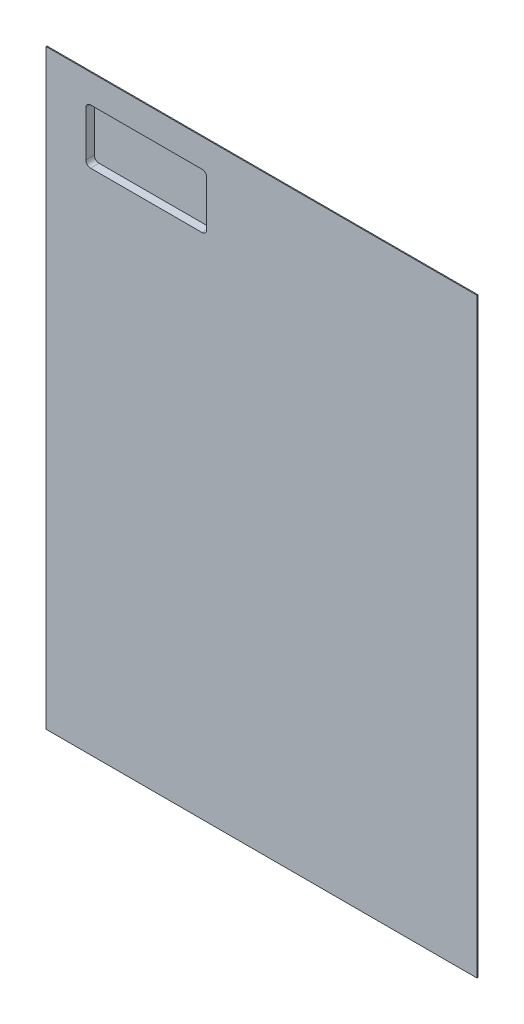
ISO-10303-21;
HEADER;
FILE_DESCRIPTION(('STEP AP214'),'2;1');
FILE_NAME('part.step','',(''),(''),'','','');
FILE_SCHEMA(('AUTOMOTIVE_DESIGN { 1 0 10303 214 1 1 1 1 }'));
ENDSEC;
DATA;
#1=APPLICATION_CONTEXT('core data for automotive mechanical design processes');
#2=APPLICATION_PROTOCOL_DEFINITION('international standard','automotive_design',2000,#1);
#3=PRODUCT_CONTEXT('',#1,'mechanical');
#4=PRODUCT('Part','Part','',(#3));
#5=PRODUCT_RELATED_PRODUCT_CATEGORY('part','',(#4));
#6=PRODUCT_DEFINITION_FORMATION('','',#4);
#7=PRODUCT_DEFINITION_CONTEXT('part definition',#1,'design');
#8=PRODUCT_DEFINITION('design','',#6,#7);
#9=PRODUCT_DEFINITION_SHAPE('','',#8);
#10=(LENGTH_UNIT() NAMED_UNIT(*) SI_UNIT(.MILLI.,.METRE.));
#11=(NAMED_UNIT(*) PLANE_ANGLE_UNIT() SI_UNIT($,.RADIAN.));
#12=(NAMED_UNIT(*) SI_UNIT($,.STERADIAN.) SOLID_ANGLE_UNIT());
#13=UNCERTAINTY_MEASURE_WITH_UNIT(LENGTH_MEASURE(1.E-05),#10,'distance_accuracy_value','');
#14=(GEOMETRIC_REPRESENTATION_CONTEXT(3) GLOBAL_UNCERTAINTY_ASSIGNED_CONTEXT((#13)) GLOBAL_UNIT_ASSIGNED_CONTEXT((#10,
#11,#12)) REPRESENTATION_CONTEXT('',''));
#15=CARTESIAN_POINT('',(0.,0.,0.));
#16=DIRECTION('',(0.,0.,1.));
#17=DIRECTION('',(1.,0.,0.));
#18=AXIS2_PLACEMENT_3D('',#15,#16,#17);
#19=CARTESIAN_POINT('',(228.,313.,-1.));
#20=DIRECTION('',(1.,0.,0.));
#21=DIRECTION('',(0.,1.,0.));
#22=AXIS2_PLACEMENT_3D('',#19,#20,#21);
#23=PLANE('',#22);
#24=DIRECTION('',(0.,1.,0.));
#25=VECTOR('',#24,1.);
#26=CARTESIAN_POINT('',(228.,313.,0.));
#27=LINE('',#26,#25);
#28=CARTESIAN_POINT('',(228.,-313.,0.));
#29=VERTEX_POINT('',#28);
#30=CARTESIAN_POINT('',(228.,313.,0.));
#31=VERTEX_POINT('',#30);
#32=EDGE_CURVE('E207',#29,#31,#27,.T.);
#33=ORIENTED_EDGE('',*,*,#32,.F.);
#34=DIRECTION('',(0.,0.,1.));
#35=VECTOR('',#34,1.);
#36=CARTESIAN_POINT('',(228.,-313.,-1.));
#37=LINE('',#36,#35);
#38=CARTESIAN_POINT('',(228.,-313.,-1.));
#39=VERTEX_POINT('',#38);
#40=EDGE_CURVE('E195',#39,#29,#37,.T.);
#41=ORIENTED_EDGE('',*,*,#40,.F.);
#42=DIRECTION('',(0.,1.,0.));
#43=VECTOR('',#42,1.);
#44=CARTESIAN_POINT('',(228.,313.,-1.));
#45=LINE('',#44,#43);
#46=CARTESIAN_POINT('',(228.,313.,-1.));
#47=VERTEX_POINT('',#46);
#48=EDGE_CURVE('E190',#39,#47,#45,.T.);
#49=ORIENTED_EDGE('',*,*,#48,.T.);
#50=DIRECTION('',(0.,0.,1.));
#51=VECTOR('',#50,1.);
#52=CARTESIAN_POINT('',(228.,313.,-1.));
#53=LINE('',#52,#51);
#54=EDGE_CURVE('E172',#47,#31,#53,.T.);
#55=ORIENTED_EDGE('',*,*,#54,.T.);
#56=EDGE_LOOP('',(#33,#41,#49,#55));
#57=FACE_BOUND('',#56,.T.);
#58=ADVANCED_FACE('F36',(#57),#23,.T.);
#59=CARTESIAN_POINT('',(-228.,-313.,-1.));
#60=DIRECTION('',(0.,-1.,0.));
#61=DIRECTION('',(0.,0.,-1.));
#62=AXIS2_PLACEMENT_3D('',#59,#60,#61);
#63=PLANE('',#62);
#64=DIRECTION('',(1.,0.,0.));
#65=VECTOR('',#64,1.);
#66=CARTESIAN_POINT('',(-228.,-313.,0.));
#67=LINE('',#66,#65);
#68=CARTESIAN_POINT('',(-228.,-313.,0.));
#69=VERTEX_POINT('',#68);
#70=EDGE_CURVE('E196',#69,#29,#67,.T.);
#71=ORIENTED_EDGE('',*,*,#70,.F.);
#72=DIRECTION('',(0.,0.,1.));
#73=VECTOR('',#72,1.);
#74=CARTESIAN_POINT('',(-228.,-313.,-1.));
#75=LINE('',#74,#73);
#76=CARTESIAN_POINT('',(-228.,-313.,-1.));
#77=VERTEX_POINT('',#76);
#78=EDGE_CURVE('E214',#77,#69,#75,.T.);
#79=ORIENTED_EDGE('',*,*,#78,.F.);
#80=DIRECTION('',(1.,0.,0.));
#81=VECTOR('',#80,1.);
#82=CARTESIAN_POINT('',(-228.,-313.,-1.));
#83=LINE('',#82,#81);
#84=EDGE_CURVE('E183',#77,#39,#83,.T.);
#85=ORIENTED_EDGE('',*,*,#84,.T.);
#86=ORIENTED_EDGE('',*,*,#40,.T.);
#87=EDGE_LOOP('',(#71,#79,#85,#86));
#88=FACE_BOUND('',#87,.T.);
#89=ADVANCED_FACE('F391',(#88),#63,.T.);
#90=CARTESIAN_POINT('',(-228.,313.,-1.));
#91=DIRECTION('',(-1.,0.,0.));
#92=DIRECTION('',(0.,-1.,0.));
#93=AXIS2_PLACEMENT_3D('',#90,#91,#92);
#94=PLANE('',#93);
#95=DIRECTION('',(0.,-1.,0.));
#96=VECTOR('',#95,1.);
#97=CARTESIAN_POINT('',(-228.,313.,0.));
#98=LINE('',#97,#96);
#99=CARTESIAN_POINT('',(-228.,313.,0.));
#100=VERTEX_POINT('',#99);
#101=EDGE_CURVE('E199',#100,#69,#98,.T.);
#102=ORIENTED_EDGE('',*,*,#101,.F.);
#103=DIRECTION('',(0.,0.,1.));
#104=VECTOR('',#103,1.);
#105=CARTESIAN_POINT('',(-228.,313.,-1.));
#106=LINE('',#105,#104);
#107=CARTESIAN_POINT('',(-228.,313.,-1.));
#108=VERTEX_POINT('',#107);
#109=EDGE_CURVE('E182',#108,#100,#106,.T.);
#110=ORIENTED_EDGE('',*,*,#109,.F.);
#111=DIRECTION('',(0.,-1.,0.));
#112=VECTOR('',#111,1.);
#113=CARTESIAN_POINT('',(-228.,313.,-1.));
#114=LINE('',#113,#112);
#115=EDGE_CURVE('E193',#108,#77,#114,.T.);
#116=ORIENTED_EDGE('',*,*,#115,.T.);
#117=ORIENTED_EDGE('',*,*,#78,.T.);
#118=EDGE_LOOP('',(#102,#110,#116,#117));
#119=FACE_BOUND('',#118,.T.);
#120=ADVANCED_FACE('F395',(#119),#94,.T.);
#121=CARTESIAN_POINT('',(-228.,313.,-1.));
#122=DIRECTION('',(0.,1.,0.));
#123=DIRECTION('',(0.,0.,1.));
#124=AXIS2_PLACEMENT_3D('',#121,#122,#123);
#125=PLANE('',#124);
#126=DIRECTION('',(-1.,0.,0.));
#127=VECTOR('',#126,1.);
#128=CARTESIAN_POINT('',(-228.,313.,0.));
#129=LINE('',#128,#127);
#130=EDGE_CURVE('E177',#31,#100,#129,.T.);
#131=ORIENTED_EDGE('',*,*,#130,.F.);
#132=ORIENTED_EDGE('',*,*,#54,.F.);
#133=DIRECTION('',(-1.,0.,0.));
#134=VECTOR('',#133,1.);
#135=CARTESIAN_POINT('',(-228.,313.,-1.));
#136=LINE('',#135,#134);
#137=EDGE_CURVE('E175',#47,#108,#136,.T.);
#138=ORIENTED_EDGE('',*,*,#137,.T.);
#139=ORIENTED_EDGE('',*,*,#109,.T.);
#140=EDGE_LOOP('',(#131,#132,#138,#139));
#141=FACE_BOUND('',#140,.T.);
#142=ADVANCED_FACE('F174',(#141),#125,.T.);
#143=CARTESIAN_POINT('',(0.,0.,-1.));
#144=DIRECTION('',(0.,0.,1.));
#145=DIRECTION('',(1.,0.,0.));
#146=AXIS2_PLACEMENT_3D('',#143,#144,#145);
#147=PLANE('',#146);
#148=DIRECTION('',(0.,-1.,0.));
#149=VECTOR('',#148,1.);
#150=CARTESIAN_POINT('',(-187.,0.,-1.));
#151=LINE('',#150,#149);
#152=CARTESIAN_POINT('',(-187.,279.,-1.));
#153=VERTEX_POINT('',#152);
#154=CARTESIAN_POINT('',(-187.,229.,-1.));
#155=VERTEX_POINT('',#154);
#156=EDGE_CURVE('E336',#153,#155,#151,.T.);
#157=ORIENTED_EDGE('',*,*,#156,.T.);
#158=CARTESIAN_POINT('',(-182.,229.,-0.999999999999999));
#159=DIRECTION('',(0.,0.,1.));
#160=DIRECTION('',(1.,0.,0.));
#161=AXIS2_PLACEMENT_3D('',#158,#159,#160);
#162=CIRCLE('',#161,5.);
#163=CARTESIAN_POINT('',(-182.,224.,-1.));
#164=VERTEX_POINT('',#163);
#165=EDGE_CURVE('E275',#155,#164,#162,.T.);
#166=ORIENTED_EDGE('',*,*,#165,.T.);
#167=DIRECTION('',(1.,0.,0.));
#168=VECTOR('',#167,1.);
#169=CARTESIAN_POINT('',(0.,224.,-1.));
#170=LINE('',#169,#168);
#171=CARTESIAN_POINT('',(-62.0000000000001,224.,-1.));
#172=VERTEX_POINT('',#171);
#173=EDGE_CURVE('E338',#164,#172,#170,.T.);
#174=ORIENTED_EDGE('',*,*,#173,.T.);
#175=CARTESIAN_POINT('',(-62.0000000000001,229.,-0.999999999999999));
#176=DIRECTION('',(0.,0.,1.));
#177=DIRECTION('',(1.,0.,0.));
#178=AXIS2_PLACEMENT_3D('',#175,#176,#177);
#179=CIRCLE('',#178,5.);
#180=CARTESIAN_POINT('',(-57.0000000000001,229.,-1.));
#181=VERTEX_POINT('',#180);
#182=EDGE_CURVE('E273',#172,#181,#179,.T.);
#183=ORIENTED_EDGE('',*,*,#182,.T.);
#184=DIRECTION('',(0.,1.,0.));
#185=VECTOR('',#184,1.);
#186=CARTESIAN_POINT('',(-57.0000000000001,0.,-1.));
#187=LINE('',#186,#185);
#188=CARTESIAN_POINT('',(-57.0000000000001,279.,-1.));
#189=VERTEX_POINT('',#188);
#190=EDGE_CURVE('E202',#181,#189,#187,.T.);
#191=ORIENTED_EDGE('',*,*,#190,.T.);
#192=CARTESIAN_POINT('',(-62.0000000000001,279.,-0.999999999999999));
#193=DIRECTION('',(0.,0.,1.));
#194=DIRECTION('',(1.,0.,0.));
#195=AXIS2_PLACEMENT_3D('',#192,#193,#194);
#196=CIRCLE('',#195,5.);
#197=CARTESIAN_POINT('',(-62.0000000000001,284.,-1.));
#198=VERTEX_POINT('',#197);
#199=EDGE_CURVE('E271',#189,#198,#196,.T.);
#200=ORIENTED_EDGE('',*,*,#199,.T.);
#201=DIRECTION('',(-1.,0.,0.));
#202=VECTOR('',#201,1.);
#203=CARTESIAN_POINT('',(0.,284.,-1.));
#204=LINE('',#203,#202);
#205=CARTESIAN_POINT('',(-182.,284.,-1.));
#206=VERTEX_POINT('',#205);
#207=EDGE_CURVE('E333',#198,#206,#204,.T.);
#208=ORIENTED_EDGE('',*,*,#207,.T.);
#209=CARTESIAN_POINT('',(-182.,279.,-0.999999999999999));
#210=DIRECTION('',(0.,0.,1.));
#211=DIRECTION('',(1.,0.,0.));
#212=AXIS2_PLACEMENT_3D('',#209,#210,#211);
#213=CIRCLE('',#212,5.);
#214=EDGE_CURVE('E277',#206,#153,#213,.T.);
#215=ORIENTED_EDGE('',*,*,#214,.T.);
#216=EDGE_LOOP('',(#157,#166,#174,#183,#191,#200,#208,#215));
#217=FACE_BOUND('',#216,.T.);
#218=ORIENTED_EDGE('',*,*,#48,.F.);
#219=ORIENTED_EDGE('',*,*,#84,.F.);
#220=ORIENTED_EDGE('',*,*,#115,.F.);
#221=ORIENTED_EDGE('',*,*,#137,.F.);
#222=EDGE_LOOP('',(#218,#219,#220,#221));
#223=FACE_BOUND('',#222,.T.);
#224=ADVANCED_FACE('F188',(#217,#223),#147,.F.);
#225=CARTESIAN_POINT('',(0.,0.,0.));
#226=DIRECTION('',(0.,0.,1.));
#227=DIRECTION('',(1.,0.,0.));
#228=AXIS2_PLACEMENT_3D('',#225,#226,#227);
#229=PLANE('',#228);
#230=DIRECTION('',(0.,-1.,0.));
#231=VECTOR('',#230,1.);
#232=CARTESIAN_POINT('',(-186.,283.,0.));
#233=LINE('',#232,#231);
#234=CARTESIAN_POINT('',(-186.,278.,0.));
#235=VERTEX_POINT('',#234);
#236=CARTESIAN_POINT('',(-186.,230.,0.));
#237=VERTEX_POINT('',#236);
#238=EDGE_CURVE('E315',#235,#237,#233,.T.);
#239=ORIENTED_EDGE('',*,*,#238,.F.);
#240=CARTESIAN_POINT('',(-181.,278.,0.));
#241=DIRECTION('',(0.,0.,1.));
#242=DIRECTION('',(1.,0.,0.));
#243=AXIS2_PLACEMENT_3D('',#240,#241,#242);
#244=CIRCLE('',#243,5.);
#245=CARTESIAN_POINT('',(-181.,283.,0.));
#246=VERTEX_POINT('',#245);
#247=EDGE_CURVE('E11',#235,#246,#244,.F.);
#248=ORIENTED_EDGE('',*,*,#247,.T.);
#249=DIRECTION('',(-1.,0.,0.));
#250=VECTOR('',#249,1.);
#251=CARTESIAN_POINT('',(-186.,283.,0.));
#252=LINE('',#251,#250);
#253=CARTESIAN_POINT('',(-63.0000000000001,283.,0.));
#254=VERTEX_POINT('',#253);
#255=EDGE_CURVE('E286',#254,#246,#252,.T.);
#256=ORIENTED_EDGE('',*,*,#255,.F.);
#257=CARTESIAN_POINT('',(-63.0000000000001,278.,0.));
#258=DIRECTION('',(0.,0.,1.));
#259=DIRECTION('',(1.,0.,0.));
#260=AXIS2_PLACEMENT_3D('',#257,#258,#259);
#261=CIRCLE('',#260,5.);
#262=CARTESIAN_POINT('',(-58.0000000000001,278.,0.));
#263=VERTEX_POINT('',#262);
#264=EDGE_CURVE('E44',#254,#263,#261,.F.);
#265=ORIENTED_EDGE('',*,*,#264,.T.);
#266=DIRECTION('',(0.,1.,0.));
#267=VECTOR('',#266,1.);
#268=CARTESIAN_POINT('',(-58.0000000000001,283.,0.));
#269=LINE('',#268,#267);
#270=CARTESIAN_POINT('',(-58.0000000000001,230.,0.));
#271=VERTEX_POINT('',#270);
#272=EDGE_CURVE('E285',#271,#263,#269,.T.);
#273=ORIENTED_EDGE('',*,*,#272,.F.);
#274=CARTESIAN_POINT('',(-63.0000000000001,230.,0.));
#275=DIRECTION('',(0.,0.,1.));
#276=DIRECTION('',(1.,0.,0.));
#277=AXIS2_PLACEMENT_3D('',#274,#275,#276);
#278=CIRCLE('',#277,5.);
#279=CARTESIAN_POINT('',(-63.0000000000001,225.,0.));
#280=VERTEX_POINT('',#279);
#281=EDGE_CURVE('E279',#271,#280,#278,.F.);
#282=ORIENTED_EDGE('',*,*,#281,.T.);
#283=DIRECTION('',(1.,0.,0.));
#284=VECTOR('',#283,1.);
#285=CARTESIAN_POINT('',(-186.,225.,0.));
#286=LINE('',#285,#284);
#287=CARTESIAN_POINT('',(-181.,225.,0.));
#288=VERTEX_POINT('',#287);
#289=EDGE_CURVE('E292',#288,#280,#286,.T.);
#290=ORIENTED_EDGE('',*,*,#289,.F.);
#291=CARTESIAN_POINT('',(-181.,230.,0.));
#292=DIRECTION('',(0.,0.,1.));
#293=DIRECTION('',(1.,0.,0.));
#294=AXIS2_PLACEMENT_3D('',#291,#292,#293);
#295=CIRCLE('',#294,5.);
#296=EDGE_CURVE('E281',#288,#237,#295,.F.);
#297=ORIENTED_EDGE('',*,*,#296,.T.);
#298=EDGE_LOOP('',(#239,#248,#256,#265,#273,#282,#290,#297));
#299=FACE_BOUND('',#298,.T.);
#300=ORIENTED_EDGE('',*,*,#32,.T.);
#301=ORIENTED_EDGE('',*,*,#130,.T.);
#302=ORIENTED_EDGE('',*,*,#101,.T.);
#303=ORIENTED_EDGE('',*,*,#70,.T.);
#304=EDGE_LOOP('',(#300,#301,#302,#303));
#305=FACE_BOUND('',#304,.T.);
#306=ADVANCED_FACE('F38',(#299,#305),#229,.T.);
#307=CARTESIAN_POINT('',(-57.0000000000001,284.,-10.));
#308=DIRECTION('',(1.,0.,0.));
#309=DIRECTION('',(0.,0.,-1.));
#310=AXIS2_PLACEMENT_3D('',#307,#308,#309);
#311=PLANE('',#310);
#312=DIRECTION('',(0.,1.,0.));
#313=VECTOR('',#312,1.);
#314=CARTESIAN_POINT('',(-57.0000000000001,284.,-10.));
#315=LINE('',#314,#313);
#316=CARTESIAN_POINT('',(-57.0000000000001,229.,-10.));
#317=VERTEX_POINT('',#316);
#318=CARTESIAN_POINT('',(-57.0000000000001,279.,-10.));
#319=VERTEX_POINT('',#318);
#320=EDGE_CURVE('E321',#317,#319,#315,.T.);
#321=ORIENTED_EDGE('',*,*,#320,.T.);
#322=DIRECTION('',(0.,0.,1.));
#323=VECTOR('',#322,1.);
#324=CARTESIAN_POINT('',(-57.0000000000001,279.,-10.));
#325=LINE('',#324,#323);
#326=EDGE_CURVE('E218',#319,#189,#325,.T.);
#327=ORIENTED_EDGE('',*,*,#326,.T.);
#328=ORIENTED_EDGE('',*,*,#190,.F.);
#329=DIRECTION('',(0.,0.,1.));
#330=VECTOR('',#329,1.);
#331=CARTESIAN_POINT('',(-57.0000000000001,229.,-10.));
#332=LINE('',#331,#330);
#333=EDGE_CURVE('E213',#181,#317,#332,.F.);
#334=ORIENTED_EDGE('',*,*,#333,.T.);
#335=EDGE_LOOP('',(#321,#327,#328,#334));
#336=FACE_BOUND('',#335,.T.);
#337=ADVANCED_FACE('F347',(#336),#311,.T.);
#338=CARTESIAN_POINT('',(-187.,224.,-10.));
#339=DIRECTION('',(0.,-1.,0.));
#340=DIRECTION('',(0.,0.,-1.));
#341=AXIS2_PLACEMENT_3D('',#338,#339,#340);
#342=PLANE('',#341);
#343=DIRECTION('',(1.,0.,0.));
#344=VECTOR('',#343,1.);
#345=CARTESIAN_POINT('',(-187.,224.,-10.));
#346=LINE('',#345,#344);
#347=CARTESIAN_POINT('',(-182.,224.,-10.));
#348=VERTEX_POINT('',#347);
#349=CARTESIAN_POINT('',(-62.0000000000001,224.,-10.));
#350=VERTEX_POINT('',#349);
#351=EDGE_CURVE('E330',#348,#350,#346,.T.);
#352=ORIENTED_EDGE('',*,*,#351,.T.);
#353=DIRECTION('',(0.,0.,1.));
#354=VECTOR('',#353,1.);
#355=CARTESIAN_POINT('',(-62.0000000000001,224.,-10.));
#356=LINE('',#355,#354);
#357=EDGE_CURVE('E236',#350,#172,#356,.T.);
#358=ORIENTED_EDGE('',*,*,#357,.T.);
#359=ORIENTED_EDGE('',*,*,#173,.F.);
#360=DIRECTION('',(0.,0.,1.));
#361=VECTOR('',#360,1.);
#362=CARTESIAN_POINT('',(-182.,224.,-10.));
#363=LINE('',#362,#361);
#364=EDGE_CURVE('E234',#164,#348,#363,.F.);
#365=ORIENTED_EDGE('',*,*,#364,.T.);
#366=EDGE_LOOP('',(#352,#358,#359,#365));
#367=FACE_BOUND('',#366,.T.);
#368=ADVANCED_FACE('F360',(#367),#342,.T.);
#369=CARTESIAN_POINT('',(-187.,284.,-10.));
#370=DIRECTION('',(-1.,0.,0.));
#371=DIRECTION('',(0.,-1.,0.));
#372=AXIS2_PLACEMENT_3D('',#369,#370,#371);
#373=PLANE('',#372);
#374=DIRECTION('',(0.,-1.,0.));
#375=VECTOR('',#374,1.);
#376=CARTESIAN_POINT('',(-187.,284.,-10.));
#377=LINE('',#376,#375);
#378=CARTESIAN_POINT('',(-187.,279.,-10.));
#379=VERTEX_POINT('',#378);
#380=CARTESIAN_POINT('',(-187.,229.,-10.));
#381=VERTEX_POINT('',#380);
#382=EDGE_CURVE('E327',#379,#381,#377,.T.);
#383=ORIENTED_EDGE('',*,*,#382,.T.);
#384=DIRECTION('',(0.,0.,1.));
#385=VECTOR('',#384,1.);
#386=CARTESIAN_POINT('',(-187.,229.,-10.));
#387=LINE('',#386,#385);
#388=EDGE_CURVE('E241',#381,#155,#387,.T.);
#389=ORIENTED_EDGE('',*,*,#388,.T.);
#390=ORIENTED_EDGE('',*,*,#156,.F.);
#391=DIRECTION('',(0.,0.,1.));
#392=VECTOR('',#391,1.);
#393=CARTESIAN_POINT('',(-187.,279.,-10.));
#394=LINE('',#393,#392);
#395=EDGE_CURVE('E239',#153,#379,#394,.F.);
#396=ORIENTED_EDGE('',*,*,#395,.T.);
#397=EDGE_LOOP('',(#383,#389,#390,#396));
#398=FACE_BOUND('',#397,.T.);
#399=ADVANCED_FACE('F368',(#398),#373,.T.);
#400=CARTESIAN_POINT('',(-187.,284.,-10.));
#401=DIRECTION('',(0.,1.,0.));
#402=DIRECTION('',(0.,0.,1.));
#403=AXIS2_PLACEMENT_3D('',#400,#401,#402);
#404=PLANE('',#403);
#405=ORIENTED_EDGE('',*,*,#207,.F.);
#406=DIRECTION('',(0.,0.,1.));
#407=VECTOR('',#406,1.);
#408=CARTESIAN_POINT('',(-62.0000000000001,284.,-10.));
#409=LINE('',#408,#407);
#410=CARTESIAN_POINT('',(-62.0000000000001,284.,-10.));
#411=VERTEX_POINT('',#410);
#412=EDGE_CURVE('E224',#198,#411,#409,.F.);
#413=ORIENTED_EDGE('',*,*,#412,.T.);
#414=DIRECTION('',(-1.,0.,0.));
#415=VECTOR('',#414,1.);
#416=CARTESIAN_POINT('',(-187.,284.,-10.));
#417=LINE('',#416,#415);
#418=CARTESIAN_POINT('',(-182.,284.,-10.));
#419=VERTEX_POINT('',#418);
#420=EDGE_CURVE('E324',#411,#419,#417,.T.);
#421=ORIENTED_EDGE('',*,*,#420,.T.);
#422=DIRECTION('',(0.,0.,1.));
#423=VECTOR('',#422,1.);
#424=CARTESIAN_POINT('',(-182.,284.,-10.));
#425=LINE('',#424,#423);
#426=EDGE_CURVE('E221',#419,#206,#425,.T.);
#427=ORIENTED_EDGE('',*,*,#426,.T.);
#428=EDGE_LOOP('',(#405,#413,#421,#427));
#429=FACE_BOUND('',#428,.T.);
#430=ADVANCED_FACE('F376',(#429),#404,.T.);
#431=CARTESIAN_POINT('',(0.,0.,-10.));
#432=DIRECTION('',(0.,0.,1.));
#433=DIRECTION('',(1.,0.,0.));
#434=AXIS2_PLACEMENT_3D('',#431,#432,#433);
#435=PLANE('',#434);
#436=ORIENTED_EDGE('',*,*,#420,.F.);
#437=CARTESIAN_POINT('',(-62.0000000000001,279.,-10.));
#438=DIRECTION('',(0.,0.,1.));
#439=DIRECTION('',(1.,0.,0.));
#440=AXIS2_PLACEMENT_3D('',#437,#438,#439);
#441=CIRCLE('',#440,5.);
#442=EDGE_CURVE('E232',#411,#319,#441,.F.);
#443=ORIENTED_EDGE('',*,*,#442,.T.);
#444=ORIENTED_EDGE('',*,*,#320,.F.);
#445=CARTESIAN_POINT('',(-62.0000000000001,229.,-10.));
#446=DIRECTION('',(0.,0.,1.));
#447=DIRECTION('',(1.,0.,0.));
#448=AXIS2_PLACEMENT_3D('',#445,#446,#447);
#449=CIRCLE('',#448,5.);
#450=EDGE_CURVE('E230',#317,#350,#449,.F.);
#451=ORIENTED_EDGE('',*,*,#450,.T.);
#452=ORIENTED_EDGE('',*,*,#351,.F.);
#453=CARTESIAN_POINT('',(-182.,229.,-10.));
#454=DIRECTION('',(0.,0.,1.));
#455=DIRECTION('',(1.,0.,0.));
#456=AXIS2_PLACEMENT_3D('',#453,#454,#455);
#457=CIRCLE('',#456,5.);
#458=EDGE_CURVE('E228',#348,#381,#457,.F.);
#459=ORIENTED_EDGE('',*,*,#458,.T.);
#460=ORIENTED_EDGE('',*,*,#382,.F.);
#461=CARTESIAN_POINT('',(-182.,279.,-10.));
#462=DIRECTION('',(0.,0.,1.));
#463=DIRECTION('',(1.,0.,0.));
#464=AXIS2_PLACEMENT_3D('',#461,#462,#463);
#465=CIRCLE('',#464,5.);
#466=EDGE_CURVE('E226',#379,#419,#465,.F.);
#467=ORIENTED_EDGE('',*,*,#466,.T.);
#468=EDGE_LOOP('',(#436,#443,#444,#451,#452,#459,#460,#467));
#469=FACE_BOUND('',#468,.T.);
#470=ADVANCED_FACE('F357',(#469),#435,.F.);
#471=CARTESIAN_POINT('',(-186.,283.,-1.));
#472=DIRECTION('',(-1.,0.,0.));
#473=DIRECTION('',(0.,0.,1.));
#474=AXIS2_PLACEMENT_3D('',#471,#472,#473);
#475=PLANE('',#474);
#476=ORIENTED_EDGE('',*,*,#238,.T.);
#477=DIRECTION('',(0.,0.,1.));
#478=VECTOR('',#477,1.);
#479=CARTESIAN_POINT('',(-186.,230.,-9.));
#480=LINE('',#479,#478);
#481=CARTESIAN_POINT('',(-186.,230.,-9.));
#482=VERTEX_POINT('',#481);
#483=EDGE_CURVE('E265',#237,#482,#480,.F.);
#484=ORIENTED_EDGE('',*,*,#483,.T.);
#485=DIRECTION('',(0.,-1.,0.));
#486=VECTOR('',#485,1.);
#487=CARTESIAN_POINT('',(-186.,0.,-9.));
#488=LINE('',#487,#486);
#489=CARTESIAN_POINT('',(-186.,278.,-9.));
#490=VERTEX_POINT('',#489);
#491=EDGE_CURVE('E307',#490,#482,#488,.T.);
#492=ORIENTED_EDGE('',*,*,#491,.F.);
#493=DIRECTION('',(0.,0.,1.));
#494=VECTOR('',#493,1.);
#495=CARTESIAN_POINT('',(-186.,278.,0.));
#496=LINE('',#495,#494);
#497=EDGE_CURVE('E262',#490,#235,#496,.T.);
#498=ORIENTED_EDGE('',*,*,#497,.T.);
#499=EDGE_LOOP('',(#476,#484,#492,#498));
#500=FACE_BOUND('',#499,.T.);
#501=ADVANCED_FACE('F416',(#500),#475,.F.);
#502=CARTESIAN_POINT('',(-186.,283.,-1.));
#503=DIRECTION('',(0.,1.,0.));
#504=DIRECTION('',(0.,0.,1.));
#505=AXIS2_PLACEMENT_3D('',#502,#503,#504);
#506=PLANE('',#505);
#507=DIRECTION('',(-1.,0.,0.));
#508=VECTOR('',#507,1.);
#509=CARTESIAN_POINT('',(0.,283.,-9.));
#510=LINE('',#509,#508);
#511=CARTESIAN_POINT('',(-63.0000000000001,283.,-9.));
#512=VERTEX_POINT('',#511);
#513=CARTESIAN_POINT('',(-181.,283.,-9.));
#514=VERTEX_POINT('',#513);
#515=EDGE_CURVE('E301',#512,#514,#510,.T.);
#516=ORIENTED_EDGE('',*,*,#515,.F.);
#517=DIRECTION('',(0.,0.,1.));
#518=VECTOR('',#517,1.);
#519=CARTESIAN_POINT('',(-63.0000000000001,283.,0.));
#520=LINE('',#519,#518);
#521=EDGE_CURVE('E269',#512,#254,#520,.T.);
#522=ORIENTED_EDGE('',*,*,#521,.T.);
#523=ORIENTED_EDGE('',*,*,#255,.T.);
#524=DIRECTION('',(0.,0.,1.));
#525=VECTOR('',#524,1.);
#526=CARTESIAN_POINT('',(-181.,283.,-9.));
#527=LINE('',#526,#525);
#528=EDGE_CURVE('E267',#246,#514,#527,.F.);
#529=ORIENTED_EDGE('',*,*,#528,.T.);
#530=EDGE_LOOP('',(#516,#522,#523,#529));
#531=FACE_BOUND('',#530,.T.);
#532=ADVANCED_FACE('F305',(#531),#506,.F.);
#533=CARTESIAN_POINT('',(-58.0000000000001,283.,-1.));
#534=DIRECTION('',(1.,0.,0.));
#535=DIRECTION('',(0.,0.,-1.));
#536=AXIS2_PLACEMENT_3D('',#533,#534,#535);
#537=PLANE('',#536);
#538=DIRECTION('',(0.,1.,0.));
#539=VECTOR('',#538,1.);
#540=CARTESIAN_POINT('',(-58.0000000000001,0.,-9.));
#541=LINE('',#540,#539);
#542=CARTESIAN_POINT('',(-58.0000000000001,230.,-9.));
#543=VERTEX_POINT('',#542);
#544=CARTESIAN_POINT('',(-58.0000000000001,278.,-9.));
#545=VERTEX_POINT('',#544);
#546=EDGE_CURVE('E303',#543,#545,#541,.T.);
#547=ORIENTED_EDGE('',*,*,#546,.F.);
#548=DIRECTION('',(0.,0.,1.));
#549=VECTOR('',#548,1.);
#550=CARTESIAN_POINT('',(-58.0000000000001,230.,0.));
#551=LINE('',#550,#549);
#552=EDGE_CURVE('E246',#543,#271,#551,.T.);
#553=ORIENTED_EDGE('',*,*,#552,.T.);
#554=ORIENTED_EDGE('',*,*,#272,.T.);
#555=DIRECTION('',(0.,0.,1.));
#556=VECTOR('',#555,1.);
#557=CARTESIAN_POINT('',(-58.0000000000001,278.,-9.));
#558=LINE('',#557,#556);
#559=EDGE_CURVE('E244',#263,#545,#558,.F.);
#560=ORIENTED_EDGE('',*,*,#559,.T.);
#561=EDGE_LOOP('',(#547,#553,#554,#560));
#562=FACE_BOUND('',#561,.T.);
#563=ADVANCED_FACE('F289',(#562),#537,.F.);
#564=CARTESIAN_POINT('',(-186.,225.,-1.));
#565=DIRECTION('',(0.,-1.,0.));
#566=DIRECTION('',(0.,0.,-1.));
#567=AXIS2_PLACEMENT_3D('',#564,#565,#566);
#568=PLANE('',#567);
#569=ORIENTED_EDGE('',*,*,#289,.T.);
#570=DIRECTION('',(0.,0.,1.));
#571=VECTOR('',#570,1.);
#572=CARTESIAN_POINT('',(-63.0000000000001,225.,-9.));
#573=LINE('',#572,#571);
#574=CARTESIAN_POINT('',(-63.0000000000001,225.,-9.));
#575=VERTEX_POINT('',#574);
#576=EDGE_CURVE('E252',#280,#575,#573,.F.);
#577=ORIENTED_EDGE('',*,*,#576,.T.);
#578=DIRECTION('',(1.,0.,0.));
#579=VECTOR('',#578,1.);
#580=CARTESIAN_POINT('',(0.,225.,-9.));
#581=LINE('',#580,#579);
#582=CARTESIAN_POINT('',(-181.,225.,-9.));
#583=VERTEX_POINT('',#582);
#584=EDGE_CURVE('E310',#583,#575,#581,.T.);
#585=ORIENTED_EDGE('',*,*,#584,.F.);
#586=DIRECTION('',(0.,0.,1.));
#587=VECTOR('',#586,1.);
#588=CARTESIAN_POINT('',(-181.,225.,0.));
#589=LINE('',#588,#587);
#590=EDGE_CURVE('E249',#583,#288,#589,.T.);
#591=ORIENTED_EDGE('',*,*,#590,.T.);
#592=EDGE_LOOP('',(#569,#577,#585,#591));
#593=FACE_BOUND('',#592,.T.);
#594=ADVANCED_FACE('F387',(#593),#568,.F.);
#595=CARTESIAN_POINT('',(0.,0.,-9.));
#596=DIRECTION('',(0.,0.,1.));
#597=DIRECTION('',(1.,0.,0.));
#598=AXIS2_PLACEMENT_3D('',#595,#596,#597);
#599=PLANE('',#598);
#600=ORIENTED_EDGE('',*,*,#584,.T.);
#601=CARTESIAN_POINT('',(-63.0000000000001,230.,-9.));
#602=DIRECTION('',(0.,0.,1.));
#603=DIRECTION('',(1.,0.,0.));
#604=AXIS2_PLACEMENT_3D('',#601,#602,#603);
#605=CIRCLE('',#604,5.);
#606=EDGE_CURVE('E260',#575,#543,#605,.T.);
#607=ORIENTED_EDGE('',*,*,#606,.T.);
#608=ORIENTED_EDGE('',*,*,#546,.T.);
#609=CARTESIAN_POINT('',(-63.0000000000001,278.,-9.));
#610=DIRECTION('',(0.,0.,1.));
#611=DIRECTION('',(1.,0.,0.));
#612=AXIS2_PLACEMENT_3D('',#609,#610,#611);
#613=CIRCLE('',#612,5.);
#614=EDGE_CURVE('E256',#545,#512,#613,.T.);
#615=ORIENTED_EDGE('',*,*,#614,.T.);
#616=ORIENTED_EDGE('',*,*,#515,.T.);
#617=CARTESIAN_POINT('',(-181.,278.,-9.));
#618=DIRECTION('',(0.,0.,1.));
#619=DIRECTION('',(1.,0.,0.));
#620=AXIS2_PLACEMENT_3D('',#617,#618,#619);
#621=CIRCLE('',#620,5.);
#622=EDGE_CURVE('E254',#514,#490,#621,.T.);
#623=ORIENTED_EDGE('',*,*,#622,.T.);
#624=ORIENTED_EDGE('',*,*,#491,.T.);
#625=CARTESIAN_POINT('',(-181.,230.,-9.));
#626=DIRECTION('',(0.,0.,1.));
#627=DIRECTION('',(1.,0.,0.));
#628=AXIS2_PLACEMENT_3D('',#625,#626,#627);
#629=CIRCLE('',#628,5.);
#630=EDGE_CURVE('E258',#482,#583,#629,.T.);
#631=ORIENTED_EDGE('',*,*,#630,.T.);
#632=EDGE_LOOP('',(#600,#607,#608,#615,#616,#623,#624,#631));
#633=FACE_BOUND('',#632,.T.);
#634=ADVANCED_FACE('F300',(#633),#599,.T.);
#635=CARTESIAN_POINT('',(-62.0000000000001,279.,-10.));
#636=DIRECTION('',(0.,0.,1.));
#637=DIRECTION('',(1.,0.,0.));
#638=AXIS2_PLACEMENT_3D('',#635,#636,#637);
#639=CYLINDRICAL_SURFACE('',#638,5.);
#640=ORIENTED_EDGE('',*,*,#442,.F.);
#641=ORIENTED_EDGE('',*,*,#412,.F.);
#642=ORIENTED_EDGE('',*,*,#199,.F.);
#643=ORIENTED_EDGE('',*,*,#326,.F.);
#644=EDGE_LOOP('',(#640,#641,#642,#643));
#645=FACE_BOUND('',#644,.T.);
#646=ADVANCED_FACE('F379',(#645),#639,.T.);
#647=CARTESIAN_POINT('',(-62.0000000000001,229.,-10.));
#648=DIRECTION('',(0.,0.,1.));
#649=DIRECTION('',(1.,0.,0.));
#650=AXIS2_PLACEMENT_3D('',#647,#648,#649);
#651=CYLINDRICAL_SURFACE('',#650,5.);
#652=ORIENTED_EDGE('',*,*,#450,.F.);
#653=ORIENTED_EDGE('',*,*,#333,.F.);
#654=ORIENTED_EDGE('',*,*,#182,.F.);
#655=ORIENTED_EDGE('',*,*,#357,.F.);
#656=EDGE_LOOP('',(#652,#653,#654,#655));
#657=FACE_BOUND('',#656,.T.);
#658=ADVANCED_FACE('F352',(#657),#651,.T.);
#659=CARTESIAN_POINT('',(-182.,229.,-10.));
#660=DIRECTION('',(0.,0.,1.));
#661=DIRECTION('',(1.,0.,0.));
#662=AXIS2_PLACEMENT_3D('',#659,#660,#661);
#663=CYLINDRICAL_SURFACE('',#662,5.);
#664=ORIENTED_EDGE('',*,*,#458,.F.);
#665=ORIENTED_EDGE('',*,*,#364,.F.);
#666=ORIENTED_EDGE('',*,*,#165,.F.);
#667=ORIENTED_EDGE('',*,*,#388,.F.);
#668=EDGE_LOOP('',(#664,#665,#666,#667));
#669=FACE_BOUND('',#668,.T.);
#670=ADVANCED_FACE('F363',(#669),#663,.T.);
#671=CARTESIAN_POINT('',(-182.,279.,-10.));
#672=DIRECTION('',(0.,0.,1.));
#673=DIRECTION('',(1.,0.,0.));
#674=AXIS2_PLACEMENT_3D('',#671,#672,#673);
#675=CYLINDRICAL_SURFACE('',#674,5.);
#676=ORIENTED_EDGE('',*,*,#466,.F.);
#677=ORIENTED_EDGE('',*,*,#395,.F.);
#678=ORIENTED_EDGE('',*,*,#214,.F.);
#679=ORIENTED_EDGE('',*,*,#426,.F.);
#680=EDGE_LOOP('',(#676,#677,#678,#679));
#681=FACE_BOUND('',#680,.T.);
#682=ADVANCED_FACE('F372',(#681),#675,.T.);
#683=CARTESIAN_POINT('',(-63.0000000000001,230.,-1.));
#684=DIRECTION('',(0.,0.,-1.));
#685=DIRECTION('',(-1.,0.,0.));
#686=AXIS2_PLACEMENT_3D('',#683,#684,#685);
#687=CYLINDRICAL_SURFACE('',#686,5.);
#688=ORIENTED_EDGE('',*,*,#606,.F.);
#689=ORIENTED_EDGE('',*,*,#576,.F.);
#690=ORIENTED_EDGE('',*,*,#281,.F.);
#691=ORIENTED_EDGE('',*,*,#552,.F.);
#692=EDGE_LOOP('',(#688,#689,#690,#691));
#693=FACE_BOUND('',#692,.T.);
#694=ADVANCED_FACE('F471',(#693),#687,.F.);
#695=CARTESIAN_POINT('',(-181.,230.,-1.));
#696=DIRECTION('',(0.,0.,-1.));
#697=DIRECTION('',(-1.,0.,0.));
#698=AXIS2_PLACEMENT_3D('',#695,#696,#697);
#699=CYLINDRICAL_SURFACE('',#698,5.);
#700=ORIENTED_EDGE('',*,*,#630,.F.);
#701=ORIENTED_EDGE('',*,*,#483,.F.);
#702=ORIENTED_EDGE('',*,*,#296,.F.);
#703=ORIENTED_EDGE('',*,*,#590,.F.);
#704=EDGE_LOOP('',(#700,#701,#702,#703));
#705=FACE_BOUND('',#704,.T.);
#706=ADVANCED_FACE('F480',(#705),#699,.F.);
#707=CARTESIAN_POINT('',(-63.0000000000001,278.,-1.));
#708=DIRECTION('',(0.,0.,-1.));
#709=DIRECTION('',(-1.,0.,0.));
#710=AXIS2_PLACEMENT_3D('',#707,#708,#709);
#711=CYLINDRICAL_SURFACE('',#710,5.);
#712=ORIENTED_EDGE('',*,*,#614,.F.);
#713=ORIENTED_EDGE('',*,*,#559,.F.);
#714=ORIENTED_EDGE('',*,*,#264,.F.);
#715=ORIENTED_EDGE('',*,*,#521,.F.);
#716=EDGE_LOOP('',(#712,#713,#714,#715));
#717=FACE_BOUND('',#716,.T.);
#718=ADVANCED_FACE('F295',(#717),#711,.F.);
#719=CARTESIAN_POINT('',(-181.,278.,-1.));
#720=DIRECTION('',(0.,0.,-1.));
#721=DIRECTION('',(-1.,0.,0.));
#722=AXIS2_PLACEMENT_3D('',#719,#720,#721);
#723=CYLINDRICAL_SURFACE('',#722,5.);
#724=ORIENTED_EDGE('',*,*,#622,.F.);
#725=ORIENTED_EDGE('',*,*,#528,.F.);
#726=ORIENTED_EDGE('',*,*,#247,.F.);
#727=ORIENTED_EDGE('',*,*,#497,.F.);
#728=EDGE_LOOP('',(#724,#725,#726,#727));
#729=FACE_BOUND('',#728,.T.);
#730=ADVANCED_FACE('F499',(#729),#723,.F.);
#731=CLOSED_SHELL('',(#58,#89,#120,#142,#224,#306,#337,#368,#399,#430,#470,#501,#532,#563,#594,
#634,#646,#658,#670,#682,#694,#706,#718,#730));
#732=MANIFOLD_SOLID_BREP('B2',#731);
#733=ADVANCED_BREP_SHAPE_REPRESENTATION('',(#18,#732),#14);
#734=SHAPE_DEFINITION_REPRESENTATION(#9,#733);
ENDSEC;
END-ISO-10303-21;
